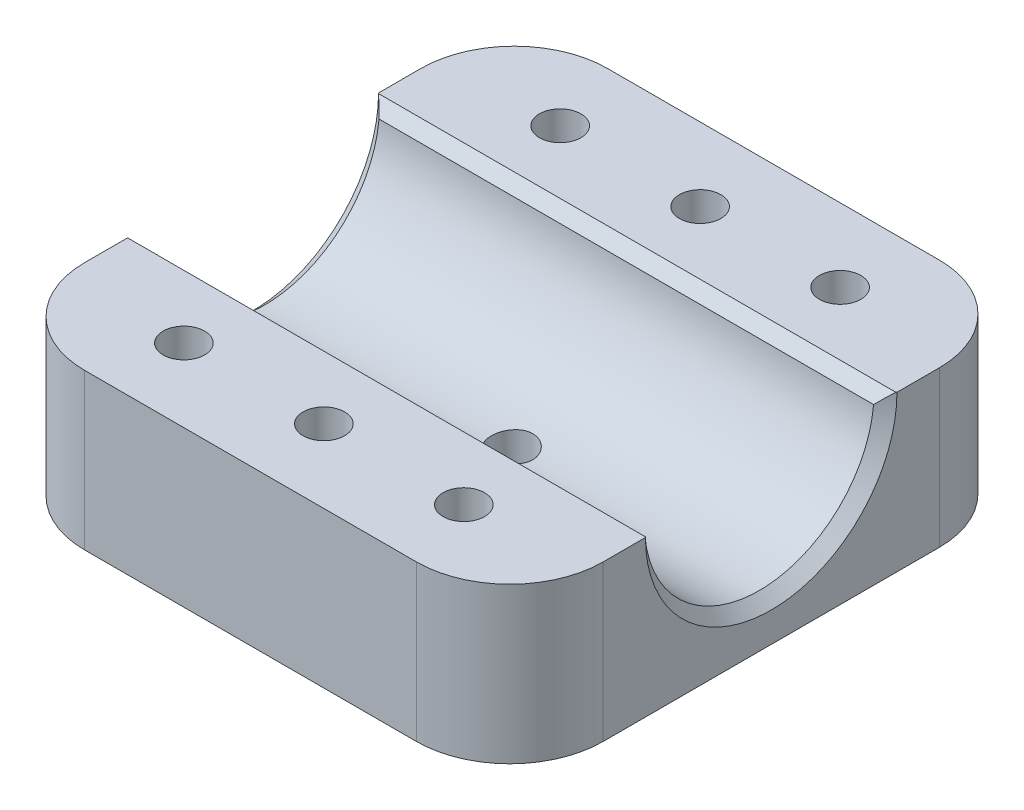
ISO-10303-21;
HEADER;
FILE_DESCRIPTION(('STEP AP214'),'2;1');
FILE_NAME('part.step','',(''),(''),'','','');
FILE_SCHEMA(('AUTOMOTIVE_DESIGN { 1 0 10303 214 1 1 1 1 }'));
ENDSEC;
DATA;
#1=APPLICATION_CONTEXT('core data for automotive mechanical design processes');
#2=APPLICATION_PROTOCOL_DEFINITION('international standard','automotive_design',2000,#1);
#3=PRODUCT_CONTEXT('',#1,'mechanical');
#4=PRODUCT('Part','Part','',(#3));
#5=PRODUCT_RELATED_PRODUCT_CATEGORY('part','',(#4));
#6=PRODUCT_DEFINITION_FORMATION('','',#4);
#7=PRODUCT_DEFINITION_CONTEXT('part definition',#1,'design');
#8=PRODUCT_DEFINITION('design','',#6,#7);
#9=PRODUCT_DEFINITION_SHAPE('','',#8);
#10=(LENGTH_UNIT() NAMED_UNIT(*) SI_UNIT(.MILLI.,.METRE.));
#11=(NAMED_UNIT(*) PLANE_ANGLE_UNIT() SI_UNIT($,.RADIAN.));
#12=(NAMED_UNIT(*) SI_UNIT($,.STERADIAN.) SOLID_ANGLE_UNIT());
#13=UNCERTAINTY_MEASURE_WITH_UNIT(LENGTH_MEASURE(1.E-05),#10,'distance_accuracy_value','');
#14=(GEOMETRIC_REPRESENTATION_CONTEXT(3) GLOBAL_UNCERTAINTY_ASSIGNED_CONTEXT((#13)) GLOBAL_UNIT_ASSIGNED_CONTEXT((#10,
#11,#12)) REPRESENTATION_CONTEXT('',''));
#15=CARTESIAN_POINT('',(0.,0.,0.));
#16=DIRECTION('',(0.,0.,1.));
#17=DIRECTION('',(1.,0.,0.));
#18=AXIS2_PLACEMENT_3D('',#15,#16,#17);
#19=CARTESIAN_POINT('',(50.,0.,-25.215));
#20=DIRECTION('',(-1.,0.,0.));
#21=DIRECTION('',(0.,0.,1.));
#22=AXIS2_PLACEMENT_3D('',#19,#20,#21);
#23=CYLINDRICAL_SURFACE('',#22,11.075);
#24=DIRECTION('',(-1.,0.,0.));
#25=VECTOR('',#24,1.);
#26=CARTESIAN_POINT('',(50.,-1.04987468829102,-14.189874688291));
#27=LINE('',#26,#25);
#28=CARTESIAN_POINT('',(1.14984968448844,-1.04987468829102,-14.189874688291));
#29=VERTEX_POINT('',#28);
#30=CARTESIAN_POINT('',(48.8501503155116,-1.04987468829102,-14.189874688291));
#31=VERTEX_POINT('',#30);
#32=EDGE_CURVE('E180',#29,#31,#27,.F.);
#33=ORIENTED_EDGE('',*,*,#32,.T.);
#34=CARTESIAN_POINT('',(48.8501503155116,0.,-25.215));
#35=DIRECTION('',(1.,0.,0.));
#36=DIRECTION('',(0.,0.,-1.));
#37=AXIS2_PLACEMENT_3D('',#34,#35,#36);
#38=CIRCLE('',#37,11.075);
#39=CARTESIAN_POINT('',(48.8501503155116,-1.04987468829102,-36.240125311709));
#40=VERTEX_POINT('',#39);
#41=EDGE_CURVE('E158',#31,#40,#38,.T.);
#42=ORIENTED_EDGE('',*,*,#41,.T.);
#43=DIRECTION('',(-1.,0.,0.));
#44=VECTOR('',#43,1.);
#45=CARTESIAN_POINT('',(50.,-1.04987468829102,-36.240125311709));
#46=LINE('',#45,#44);
#47=CARTESIAN_POINT('',(1.14984968448844,-1.04987468829102,-36.240125311709));
#48=VERTEX_POINT('',#47);
#49=EDGE_CURVE('E168',#40,#48,#46,.T.);
#50=ORIENTED_EDGE('',*,*,#49,.T.);
#51=CARTESIAN_POINT('',(1.14984968448844,0.,-25.215));
#52=DIRECTION('',(1.,0.,0.));
#53=DIRECTION('',(0.,0.,-1.));
#54=AXIS2_PLACEMENT_3D('',#51,#52,#53);
#55=CIRCLE('',#54,11.075);
#56=EDGE_CURVE('E175',#48,#29,#55,.F.);
#57=ORIENTED_EDGE('',*,*,#56,.T.);
#58=EDGE_LOOP('',(#33,#42,#50,#57));
#59=FACE_BOUND('',#58,.T.);
#60=CARTESIAN_POINT('',(25.,-10.8929162761861,-23.215));
#61=CARTESIAN_POINT('',(25.1113536940329,-10.892918389051,-23.2150043457988));
#62=CARTESIAN_POINT('',(25.2227646677859,-10.8946422884497,-23.2243312667743));
#63=CARTESIAN_POINT('',(25.4424504505853,-10.901343835157,-23.2613704590256));
#64=CARTESIAN_POINT('',(25.5507224331487,-10.9063243252863,-23.2890987940185));
#65=CARTESIAN_POINT('',(25.7609195576848,-10.9189569950914,-23.3620660279349));
#66=CARTESIAN_POINT('',(25.8628503067389,-10.9266067737828,-23.4072891944845));
#67=CARTESIAN_POINT('',(26.0576698569108,-10.9437132445331,-23.5139215128231));
#68=CARTESIAN_POINT('',(26.1505594693696,-10.9531697742301,-23.5753292103943));
#69=CARTESIAN_POINT('',(26.3257413903498,-10.972946272248,-23.713343784722));
#70=CARTESIAN_POINT('',(26.4079140871187,-10.9832741630362,-23.7901013715743));
#71=CARTESIAN_POINT('',(26.5582885540327,-11.0035595815764,-23.9563111244024));
#72=CARTESIAN_POINT('',(26.626489438445,-11.0135170858152,-24.0457640945847));
#73=CARTESIAN_POINT('',(26.7474394936063,-11.0320243248526,-24.2356074687583));
#74=CARTESIAN_POINT('',(26.8000763767631,-11.0405636434296,-24.3360705139597));
#75=CARTESIAN_POINT('',(26.8876814163901,-11.0551838557033,-24.544593350971));
#76=CARTESIAN_POINT('',(26.9226509203618,-11.0612649368842,-24.6526525627003));
#77=CARTESIAN_POINT('',(26.9735600302572,-11.070227552519,-24.8720619990178));
#78=CARTESIAN_POINT('',(26.9897010654613,-11.0731429302996,-24.9833640811887));
#79=CARTESIAN_POINT('',(27.0031222415719,-11.0755621777131,-25.2071321837155));
#80=CARTESIAN_POINT('',(27.0004038770695,-11.0750663176838,-25.3195981111324));
#81=CARTESIAN_POINT('',(26.9763387973658,-11.0707455248283,-25.5411214618447));
#82=CARTESIAN_POINT('',(26.9552089317007,-11.0669593465443,-25.6502033072089));
#83=CARTESIAN_POINT('',(26.8952630957274,-11.0565266996438,-25.863247275925));
#84=CARTESIAN_POINT('',(26.8564465160142,-11.0498801324715,-25.9672092227315));
#85=CARTESIAN_POINT('',(26.7620194492721,-11.0344083094483,-26.1676967596847));
#86=CARTESIAN_POINT('',(26.7063213612937,-11.0255717339673,-26.2641801817088));
#87=CARTESIAN_POINT('',(26.5797767574139,-11.0066987085288,-26.4465125101493));
#88=CARTESIAN_POINT('',(26.5089288086649,-10.9966621451182,-26.5323604094627));
#89=CARTESIAN_POINT('',(26.3528979171713,-10.9763338138186,-26.6922684115402));
#90=CARTESIAN_POINT('',(26.2675253145129,-10.9660404467502,-26.7661433682394));
#91=CARTESIAN_POINT('',(26.0855027975052,-10.946495721031,-26.8985527077549));
#92=CARTESIAN_POINT('',(25.9888527408879,-10.9372443755285,-26.9570868970133));
#93=CARTESIAN_POINT('',(25.7867840138122,-10.9208293251869,-27.0572002201364));
#94=CARTESIAN_POINT('',(25.6813525334477,-10.9136687413068,-27.0987540433314));
#95=CARTESIAN_POINT('',(25.464846632483,-10.9022949677093,-27.1635073612001));
#96=CARTESIAN_POINT('',(25.3537728029004,-10.8980814699744,-27.1867087740266));
#97=CARTESIAN_POINT('',(25.1308002567386,-10.8931394351379,-27.2138316718859));
#98=CARTESIAN_POINT('',(25.0189348404857,-10.8923629503183,-27.2180184405344));
#99=CARTESIAN_POINT('',(24.7961028347459,-10.8942547563627,-27.2077028884008));
#100=CARTESIAN_POINT('',(24.6851362044241,-10.896922889832,-27.1932014215388));
#101=CARTESIAN_POINT('',(24.4681136604313,-10.9053587631119,-27.1461482546176));
#102=CARTESIAN_POINT('',(24.3620268954011,-10.9111028508407,-27.1137342304303));
#103=CARTESIAN_POINT('',(24.1567904507839,-10.9250232265513,-27.0319215591093));
#104=CARTESIAN_POINT('',(24.0576412504744,-10.9331996823674,-26.9825217399137));
#105=CARTESIAN_POINT('',(23.8679215906163,-10.95117346907,-26.8675238569366));
#106=CARTESIAN_POINT('',(23.7774548066249,-10.9609872789544,-26.8017573762129));
#107=CARTESIAN_POINT('',(23.6087454058904,-10.9810830274729,-26.6561215300953));
#108=CARTESIAN_POINT('',(23.5305038063092,-10.9913650049678,-26.5762509923894));
#109=CARTESIAN_POINT('',(23.3874823911781,-11.0113918224963,-26.4034926740897));
#110=CARTESIAN_POINT('',(23.3228804792461,-11.0211284751913,-26.310456515694));
#111=CARTESIAN_POINT('',(23.2102245472426,-11.0388321041482,-26.1146974239208));
#112=CARTESIAN_POINT('',(23.162169923359,-11.0467991449795,-26.0119748441762));
#113=CARTESIAN_POINT('',(23.0842426256872,-11.0600305418415,-25.8002630426095));
#114=CARTESIAN_POINT('',(23.0542806216788,-11.065308156083,-25.6913075662955));
#115=CARTESIAN_POINT('',(23.0131030425445,-11.072622443831,-25.4698071689646));
#116=CARTESIAN_POINT('',(23.0018856438131,-11.074659432607,-25.3572625982056));
#117=CARTESIAN_POINT('',(22.9985754059351,-11.0752573113561,-25.1334885574448));
#118=CARTESIAN_POINT('',(23.0062131999577,-11.0738671620923,-25.0222631124987));
#119=CARTESIAN_POINT('',(23.039809105836,-11.067868081712,-24.8027076371961));
#120=CARTESIAN_POINT('',(23.0657670687041,-11.0632591767717,-24.6943775833006));
#121=CARTESIAN_POINT('',(23.1351563606031,-11.0513396837443,-24.4838168273849));
#122=CARTESIAN_POINT('',(23.1785609869827,-11.0440332257308,-24.3815770773001));
#123=CARTESIAN_POINT('',(23.2815800621458,-11.027511835667,-24.1857907506913));
#124=CARTESIAN_POINT('',(23.3411954902064,-11.0182967883289,-24.0922446998024));
#125=CARTESIAN_POINT('',(23.4758807363429,-10.9988216262283,-23.9151537180067));
#126=CARTESIAN_POINT('',(23.5511461068702,-10.988549210148,-23.8317588488928));
#127=CARTESIAN_POINT('',(23.7145871266544,-10.968197241856,-23.6786889165902));
#128=CARTESIAN_POINT('',(23.8027658012179,-10.9581177354663,-23.6090170774032));
#129=CARTESIAN_POINT('',(23.9904233185879,-10.9391997669254,-23.4848194546358));
#130=CARTESIAN_POINT('',(24.0899916689474,-10.9303725569761,-23.4304271581896));
#131=CARTESIAN_POINT('',(24.296977167732,-10.9150930928943,-23.3392271609959));
#132=CARTESIAN_POINT('',(24.404386641961,-10.9086385529839,-23.3024025257101));
#133=CARTESIAN_POINT('',(24.5934579436549,-10.90021082846,-23.2550454155816));
#134=CARTESIAN_POINT('',(24.6739990415081,-10.8974912539126,-23.2400535454527));
#135=CARTESIAN_POINT('',(24.8363497995602,-10.8938432226872,-23.2200293593708));
#136=CARTESIAN_POINT('',(24.9181594294732,-10.8929147233138,-23.2149968060094));
#137=CARTESIAN_POINT('',(25.,-10.8929162761861,-23.215));
#138=B_SPLINE_CURVE_WITH_KNOTS('',3,(#60,#61,#62,#63,#64,#65,#66,#67,#68,#69,#70,#71,#72,#73,
#74,#75,#76,#77,#78,#79,#80,#81,#82,#83,#84,#85,#86,#87,#88,#89,#90,#91,#92,#93,#94,#95,#96,#97,
#98,#99,#100,#101,#102,#103,#104,#105,#106,#107,#108,#109,#110,#111,#112,#113,#114,#115,#116,
#117,#118,#119,#120,#121,#122,#123,#124,#125,#126,#127,#128,#129,#130,#131,#132,#133,#134,#135,
#136,#137),.UNSPECIFIED.,.T.,.F.,(4,2,2,2,2,2,2,2,2,2,2,2,2,2,2,2,2,2,2,2,2,2,2,2,2,2,2,2,2,2,2,
2,2,2,2,2,2,2,4),(0.,0.333761663850657,0.667815072563988,1.00156877663258,1.33529250237122,
1.67246971129049,2.00966828870264,2.34924336121043,2.68879253021281,3.02467484272518,
3.36053053715841,3.69248321009001,4.0244473214876,4.35816443159666,4.69191311806564,
5.03041156733624,5.36891428731549,5.70791974967007,6.04688977524767,6.38111581969542,
6.7153265929222,7.04700364783416,7.3787035938776,7.71396919555588,8.0492626772261,
8.38869086857851,8.72810667284707,9.06583264879393,9.40352576649545,9.73642256522186,
10.0693166567166,10.401703171971,10.7341097707942,11.070950668557,11.4078706074446,
11.7476484208781,12.0870980366405,12.3324055352903,12.577707186275),.UNSPECIFIED.);
#139=CARTESIAN_POINT('',(25.,-10.8929162761861,-23.215));
#140=VERTEX_POINT('',#139);
#141=EDGE_CURVE('E401',#140,#140,#138,.T.);
#142=ORIENTED_EDGE('',*,*,#141,.F.);
#143=EDGE_LOOP('',(#142));
#144=FACE_BOUND('',#143,.T.);
#145=ADVANCED_FACE('F49',(#59,#144),#23,.F.);
#146=CARTESIAN_POINT('',(50.,0.,0.));
#147=DIRECTION('',(0.,1.,0.));
#148=DIRECTION('',(0.,0.,1.));
#149=AXIS2_PLACEMENT_3D('',#146,#147,#148);
#150=PLANE('',#149);
#151=CARTESIAN_POINT('',(38.5,0.,-7.07));
#152=DIRECTION('',(0.,1.,0.));
#153=DIRECTION('',(0.,0.,1.));
#154=AXIS2_PLACEMENT_3D('',#151,#152,#153);
#155=CIRCLE('',#154,2.);
#156=CARTESIAN_POINT('',(38.5,0.,-5.07));
#157=VERTEX_POINT('',#156);
#158=EDGE_CURVE('E381',#157,#157,#155,.T.);
#159=ORIENTED_EDGE('',*,*,#158,.F.);
#160=EDGE_LOOP('',(#159));
#161=FACE_BOUND('',#160,.T.);
#162=CARTESIAN_POINT('',(11.5,0.,-7.07));
#163=DIRECTION('',(0.,1.,0.));
#164=DIRECTION('',(0.,0.,-1.));
#165=AXIS2_PLACEMENT_3D('',#162,#163,#164);
#166=CIRCLE('',#165,2.);
#167=CARTESIAN_POINT('',(11.5,0.,-9.07));
#168=VERTEX_POINT('',#167);
#169=EDGE_CURVE('E373',#168,#168,#166,.T.);
#170=ORIENTED_EDGE('',*,*,#169,.F.);
#171=EDGE_LOOP('',(#170));
#172=FACE_BOUND('',#171,.T.);
#173=CARTESIAN_POINT('',(25.,0.,-7.07));
#174=DIRECTION('',(0.,1.,0.));
#175=DIRECTION('',(0.,0.,1.));
#176=AXIS2_PLACEMENT_3D('',#173,#174,#175);
#177=CIRCLE('',#176,2.);
#178=CARTESIAN_POINT('',(25.,0.,-5.07));
#179=VERTEX_POINT('',#178);
#180=EDGE_CURVE('E353',#179,#179,#177,.T.);
#181=ORIENTED_EDGE('',*,*,#180,.F.);
#182=EDGE_LOOP('',(#181));
#183=FACE_BOUND('',#182,.T.);
#184=DIRECTION('',(0.,0.,-1.));
#185=VECTOR('',#184,1.);
#186=CARTESIAN_POINT('',(0.,0.,0.));
#187=LINE('',#186,#185);
#188=CARTESIAN_POINT('',(0.,0.,-9.));
#189=VERTEX_POINT('',#188);
#190=CARTESIAN_POINT('',(0.,0.,-13.0853759622601));
#191=VERTEX_POINT('',#190);
#192=EDGE_CURVE('E405',#189,#191,#187,.T.);
#193=ORIENTED_EDGE('',*,*,#192,.F.);
#194=CARTESIAN_POINT('',(9.,0.,-9.));
#195=DIRECTION('',(0.,1.,0.));
#196=DIRECTION('',(0.,0.,1.));
#197=AXIS2_PLACEMENT_3D('',#194,#195,#196);
#198=CIRCLE('',#197,9.);
#199=CARTESIAN_POINT('',(9.,0.,0.));
#200=VERTEX_POINT('',#199);
#201=EDGE_CURVE('E292',#189,#200,#198,.T.);
#202=ORIENTED_EDGE('',*,*,#201,.T.);
#203=DIRECTION('',(-1.,0.,0.));
#204=VECTOR('',#203,1.);
#205=CARTESIAN_POINT('',(50.,0.,0.));
#206=LINE('',#205,#204);
#207=CARTESIAN_POINT('',(41.,0.,0.));
#208=VERTEX_POINT('',#207);
#209=EDGE_CURVE('E176',#208,#200,#206,.T.);
#210=ORIENTED_EDGE('',*,*,#209,.F.);
#211=CARTESIAN_POINT('',(41.,0.,-9.));
#212=DIRECTION('',(0.,1.,0.));
#213=DIRECTION('',(0.,0.,1.));
#214=AXIS2_PLACEMENT_3D('',#211,#212,#213);
#215=CIRCLE('',#214,9.);
#216=CARTESIAN_POINT('',(50.,0.,-9.));
#217=VERTEX_POINT('',#216);
#218=EDGE_CURVE('E289',#208,#217,#215,.T.);
#219=ORIENTED_EDGE('',*,*,#218,.T.);
#220=DIRECTION('',(0.,0.,-1.));
#221=VECTOR('',#220,1.);
#222=CARTESIAN_POINT('',(50.,0.,0.));
#223=LINE('',#222,#221);
#224=CARTESIAN_POINT('',(50.,0.,-13.0853759622601));
#225=VERTEX_POINT('',#224);
#226=EDGE_CURVE('E322',#217,#225,#223,.T.);
#227=ORIENTED_EDGE('',*,*,#226,.T.);
#228=DIRECTION('',(0.73696410507802,0.,0.675931881055001));
#229=VECTOR('',#228,1.);
#230=CARTESIAN_POINT('',(36.7751503155117,0.,-25.215));
#231=LINE('',#230,#229);
#232=CARTESIAN_POINT('',(49.9404437692362,0.,-13.14));
#233=VERTEX_POINT('',#232);
#234=EDGE_CURVE('E207',#225,#233,#231,.F.);
#235=ORIENTED_EDGE('',*,*,#234,.T.);
#236=DIRECTION('',(-1.,0.,0.));
#237=VECTOR('',#236,1.);
#238=CARTESIAN_POINT('',(50.,0.,-13.14));
#239=LINE('',#238,#237);
#240=CARTESIAN_POINT('',(0.0595562307638409,0.,-13.14));
#241=VERTEX_POINT('',#240);
#242=EDGE_CURVE('E204',#233,#241,#239,.T.);
#243=ORIENTED_EDGE('',*,*,#242,.T.);
#244=DIRECTION('',(0.73696410507802,0.,-0.675931881055001));
#245=VECTOR('',#244,1.);
#246=CARTESIAN_POINT('',(13.2248496844883,0.,-25.215));
#247=LINE('',#246,#245);
#248=EDGE_CURVE('E200',#241,#191,#247,.F.);
#249=ORIENTED_EDGE('',*,*,#248,.T.);
#250=EDGE_LOOP('',(#193,#202,#210,#219,#227,#235,#243,#249));
#251=FACE_BOUND('',#250,.T.);
#252=ADVANCED_FACE('F454',(#161,#172,#183,#251),#150,.T.);
#253=CARTESIAN_POINT('',(50.,0.,0.));
#254=DIRECTION('',(0.,0.,-1.));
#255=DIRECTION('',(0.,1.,0.));
#256=AXIS2_PLACEMENT_3D('',#253,#254,#255);
#257=PLANE('',#256);
#258=ORIENTED_EDGE('',*,*,#209,.T.);
#259=DIRECTION('',(0.,-1.,0.));
#260=VECTOR('',#259,1.);
#261=CARTESIAN_POINT('',(9.,0.,0.));
#262=LINE('',#261,#260);
#263=CARTESIAN_POINT('',(9.,-15.,0.));
#264=VERTEX_POINT('',#263);
#265=EDGE_CURVE('E266',#200,#264,#262,.T.);
#266=ORIENTED_EDGE('',*,*,#265,.T.);
#267=DIRECTION('',(-1.,0.,0.));
#268=VECTOR('',#267,1.);
#269=CARTESIAN_POINT('',(50.,-15.,0.));
#270=LINE('',#269,#268);
#271=CARTESIAN_POINT('',(41.,-15.,0.));
#272=VERTEX_POINT('',#271);
#273=EDGE_CURVE('E333',#272,#264,#270,.T.);
#274=ORIENTED_EDGE('',*,*,#273,.F.);
#275=DIRECTION('',(0.,-1.,0.));
#276=VECTOR('',#275,1.);
#277=CARTESIAN_POINT('',(41.,0.,0.));
#278=LINE('',#277,#276);
#279=EDGE_CURVE('E213',#272,#208,#278,.F.);
#280=ORIENTED_EDGE('',*,*,#279,.T.);
#281=EDGE_LOOP('',(#258,#266,#274,#280));
#282=FACE_BOUND('',#281,.T.);
#283=ADVANCED_FACE('F451',(#282),#257,.F.);
#284=CARTESIAN_POINT('',(50.,-15.,0.));
#285=DIRECTION('',(0.,-1.,0.));
#286=DIRECTION('',(0.,0.,-1.));
#287=AXIS2_PLACEMENT_3D('',#284,#285,#286);
#288=PLANE('',#287);
#289=CARTESIAN_POINT('',(38.5,-15.,-43.36));
#290=DIRECTION('',(0.,1.,0.));
#291=DIRECTION('',(0.,0.,-1.));
#292=AXIS2_PLACEMENT_3D('',#289,#290,#291);
#293=CIRCLE('',#292,2.);
#294=CARTESIAN_POINT('',(38.5,-15.,-45.36));
#295=VERTEX_POINT('',#294);
#296=EDGE_CURVE('E385',#295,#295,#293,.T.);
#297=ORIENTED_EDGE('',*,*,#296,.T.);
#298=EDGE_LOOP('',(#297));
#299=FACE_BOUND('',#298,.T.);
#300=CARTESIAN_POINT('',(38.5,-15.,-7.06999999999999));
#301=DIRECTION('',(0.,1.,0.));
#302=DIRECTION('',(0.,0.,1.));
#303=AXIS2_PLACEMENT_3D('',#300,#301,#302);
#304=CIRCLE('',#303,2.);
#305=CARTESIAN_POINT('',(38.5,-15.,-5.07));
#306=VERTEX_POINT('',#305);
#307=EDGE_CURVE('E377',#306,#306,#304,.T.);
#308=ORIENTED_EDGE('',*,*,#307,.T.);
#309=EDGE_LOOP('',(#308));
#310=FACE_BOUND('',#309,.T.);
#311=CARTESIAN_POINT('',(11.5,-15.,-7.06999999999999));
#312=DIRECTION('',(0.,1.,0.));
#313=DIRECTION('',(0.,0.,-1.));
#314=AXIS2_PLACEMENT_3D('',#311,#312,#313);
#315=CIRCLE('',#314,2.);
#316=CARTESIAN_POINT('',(11.5,-15.,-9.06999999999999));
#317=VERTEX_POINT('',#316);
#318=EDGE_CURVE('E369',#317,#317,#315,.T.);
#319=ORIENTED_EDGE('',*,*,#318,.T.);
#320=EDGE_LOOP('',(#319));
#321=FACE_BOUND('',#320,.T.);
#322=CARTESIAN_POINT('',(25.,-15.,-25.215));
#323=DIRECTION('',(0.,1.,0.));
#324=DIRECTION('',(0.,0.,1.));
#325=AXIS2_PLACEMENT_3D('',#322,#323,#324);
#326=CIRCLE('',#325,2.00000000000001);
#327=CARTESIAN_POINT('',(25.,-15.,-23.215));
#328=VERTEX_POINT('',#327);
#329=EDGE_CURVE('E365',#328,#328,#326,.T.);
#330=ORIENTED_EDGE('',*,*,#329,.T.);
#331=EDGE_LOOP('',(#330));
#332=FACE_BOUND('',#331,.T.);
#333=CARTESIAN_POINT('',(25.,-15.,-43.36));
#334=DIRECTION('',(0.,1.,0.));
#335=DIRECTION('',(0.,0.,1.));
#336=AXIS2_PLACEMENT_3D('',#333,#334,#335);
#337=CIRCLE('',#336,2.);
#338=CARTESIAN_POINT('',(25.,-15.,-41.36));
#339=VERTEX_POINT('',#338);
#340=EDGE_CURVE('E357',#339,#339,#337,.T.);
#341=ORIENTED_EDGE('',*,*,#340,.T.);
#342=EDGE_LOOP('',(#341));
#343=FACE_BOUND('',#342,.T.);
#344=CARTESIAN_POINT('',(25.,-15.,-7.06999999999999));
#345=DIRECTION('',(0.,1.,0.));
#346=DIRECTION('',(0.,0.,1.));
#347=AXIS2_PLACEMENT_3D('',#344,#345,#346);
#348=CIRCLE('',#347,2.);
#349=CARTESIAN_POINT('',(25.,-15.,-5.06999999999999));
#350=VERTEX_POINT('',#349);
#351=EDGE_CURVE('E259',#350,#350,#348,.T.);
#352=ORIENTED_EDGE('',*,*,#351,.T.);
#353=EDGE_LOOP('',(#352));
#354=FACE_BOUND('',#353,.T.);
#355=CARTESIAN_POINT('',(11.5,-15.,-43.36));
#356=DIRECTION('',(0.,1.,0.));
#357=DIRECTION('',(0.,0.,1.));
#358=AXIS2_PLACEMENT_3D('',#355,#356,#357);
#359=CIRCLE('',#358,2.);
#360=CARTESIAN_POINT('',(11.5,-15.,-41.36));
#361=VERTEX_POINT('',#360);
#362=EDGE_CURVE('E397',#361,#361,#359,.T.);
#363=ORIENTED_EDGE('',*,*,#362,.T.);
#364=EDGE_LOOP('',(#363));
#365=FACE_BOUND('',#364,.T.);
#366=ORIENTED_EDGE('',*,*,#273,.T.);
#367=CARTESIAN_POINT('',(9.,-15.,-9.));
#368=DIRECTION('',(0.,-1.,0.));
#369=DIRECTION('',(0.,0.,-1.));
#370=AXIS2_PLACEMENT_3D('',#367,#368,#369);
#371=CIRCLE('',#370,9.);
#372=CARTESIAN_POINT('',(0.,-15.,-9.));
#373=VERTEX_POINT('',#372);
#374=EDGE_CURVE('E279',#264,#373,#371,.T.);
#375=ORIENTED_EDGE('',*,*,#374,.T.);
#376=DIRECTION('',(0.,0.,1.));
#377=VECTOR('',#376,1.);
#378=CARTESIAN_POINT('',(0.,-15.,0.));
#379=LINE('',#378,#377);
#380=CARTESIAN_POINT('',(0.,-15.,-41.43));
#381=VERTEX_POINT('',#380);
#382=EDGE_CURVE('E323',#381,#373,#379,.T.);
#383=ORIENTED_EDGE('',*,*,#382,.F.);
#384=CARTESIAN_POINT('',(9.,-15.,-41.43));
#385=DIRECTION('',(0.,-1.,0.));
#386=DIRECTION('',(0.,0.,-1.));
#387=AXIS2_PLACEMENT_3D('',#384,#385,#386);
#388=CIRCLE('',#387,9.);
#389=CARTESIAN_POINT('',(9.,-15.,-50.43));
#390=VERTEX_POINT('',#389);
#391=EDGE_CURVE('E270',#381,#390,#388,.T.);
#392=ORIENTED_EDGE('',*,*,#391,.T.);
#393=DIRECTION('',(-1.,0.,0.));
#394=VECTOR('',#393,1.);
#395=CARTESIAN_POINT('',(50.,-15.,-50.43));
#396=LINE('',#395,#394);
#397=CARTESIAN_POINT('',(41.,-15.,-50.43));
#398=VERTEX_POINT('',#397);
#399=EDGE_CURVE('E329',#398,#390,#396,.T.);
#400=ORIENTED_EDGE('',*,*,#399,.F.);
#401=CARTESIAN_POINT('',(41.,-15.,-41.43));
#402=DIRECTION('',(0.,-1.,0.));
#403=DIRECTION('',(0.,0.,-1.));
#404=AXIS2_PLACEMENT_3D('',#401,#402,#403);
#405=CIRCLE('',#404,9.);
#406=CARTESIAN_POINT('',(50.,-15.,-41.43));
#407=VERTEX_POINT('',#406);
#408=EDGE_CURVE('E273',#398,#407,#405,.T.);
#409=ORIENTED_EDGE('',*,*,#408,.T.);
#410=DIRECTION('',(0.,0.,1.));
#411=VECTOR('',#410,1.);
#412=CARTESIAN_POINT('',(50.,-15.,0.));
#413=LINE('',#412,#411);
#414=CARTESIAN_POINT('',(50.,-15.,-9.));
#415=VERTEX_POINT('',#414);
#416=EDGE_CURVE('E412',#407,#415,#413,.T.);
#417=ORIENTED_EDGE('',*,*,#416,.T.);
#418=CARTESIAN_POINT('',(41.,-15.,-9.));
#419=DIRECTION('',(0.,-1.,0.));
#420=DIRECTION('',(0.,0.,-1.));
#421=AXIS2_PLACEMENT_3D('',#418,#419,#420);
#422=CIRCLE('',#421,9.);
#423=EDGE_CURVE('E276',#415,#272,#422,.T.);
#424=ORIENTED_EDGE('',*,*,#423,.T.);
#425=EDGE_LOOP('',(#366,#375,#383,#392,#400,#409,#417,#424));
#426=FACE_BOUND('',#425,.T.);
#427=ADVANCED_FACE('F328',(#299,#310,#321,#332,#343,#354,#365,#426),#288,.T.);
#428=CARTESIAN_POINT('',(50.,0.,-50.43));
#429=DIRECTION('',(0.,0.,-1.));
#430=DIRECTION('',(-1.,0.,0.));
#431=AXIS2_PLACEMENT_3D('',#428,#429,#430);
#432=PLANE('',#431);
#433=DIRECTION('',(-1.,0.,0.));
#434=VECTOR('',#433,1.);
#435=CARTESIAN_POINT('',(50.,0.,-50.43));
#436=LINE('',#435,#434);
#437=CARTESIAN_POINT('',(41.,0.,-50.43));
#438=VERTEX_POINT('',#437);
#439=CARTESIAN_POINT('',(9.,0.,-50.43));
#440=VERTEX_POINT('',#439);
#441=EDGE_CURVE('E312',#438,#440,#436,.T.);
#442=ORIENTED_EDGE('',*,*,#441,.F.);
#443=DIRECTION('',(0.,-1.,0.));
#444=VECTOR('',#443,1.);
#445=CARTESIAN_POINT('',(41.,0.,-50.43));
#446=LINE('',#445,#444);
#447=EDGE_CURVE('E304',#438,#398,#446,.T.);
#448=ORIENTED_EDGE('',*,*,#447,.T.);
#449=ORIENTED_EDGE('',*,*,#399,.T.);
#450=DIRECTION('',(0.,-1.,0.));
#451=VECTOR('',#450,1.);
#452=CARTESIAN_POINT('',(9.,0.,-50.43));
#453=LINE('',#452,#451);
#454=EDGE_CURVE('E65',#390,#440,#453,.F.);
#455=ORIENTED_EDGE('',*,*,#454,.T.);
#456=EDGE_LOOP('',(#442,#448,#449,#455));
#457=FACE_BOUND('',#456,.T.);
#458=ADVANCED_FACE('F330',(#457),#432,.T.);
#459=CARTESIAN_POINT('',(50.,0.,0.));
#460=DIRECTION('',(0.,-1.,0.));
#461=DIRECTION('',(0.,0.,-1.));
#462=AXIS2_PLACEMENT_3D('',#459,#460,#461);
#463=PLANE('',#462);
#464=CARTESIAN_POINT('',(38.5,0.,-43.36));
#465=DIRECTION('',(0.,1.,0.));
#466=DIRECTION('',(0.,0.,-1.));
#467=AXIS2_PLACEMENT_3D('',#464,#465,#466);
#468=CIRCLE('',#467,2.);
#469=CARTESIAN_POINT('',(38.5,0.,-45.36));
#470=VERTEX_POINT('',#469);
#471=EDGE_CURVE('E389',#470,#470,#468,.T.);
#472=ORIENTED_EDGE('',*,*,#471,.F.);
#473=EDGE_LOOP('',(#472));
#474=FACE_BOUND('',#473,.T.);
#475=CARTESIAN_POINT('',(25.,0.,-43.36));
#476=DIRECTION('',(0.,1.,0.));
#477=DIRECTION('',(0.,0.,1.));
#478=AXIS2_PLACEMENT_3D('',#475,#476,#477);
#479=CIRCLE('',#478,2.);
#480=CARTESIAN_POINT('',(25.,0.,-41.36));
#481=VERTEX_POINT('',#480);
#482=EDGE_CURVE('E361',#481,#481,#479,.T.);
#483=ORIENTED_EDGE('',*,*,#482,.F.);
#484=EDGE_LOOP('',(#483));
#485=FACE_BOUND('',#484,.T.);
#486=CARTESIAN_POINT('',(11.5,0.,-43.36));
#487=DIRECTION('',(0.,1.,0.));
#488=DIRECTION('',(0.,0.,1.));
#489=AXIS2_PLACEMENT_3D('',#486,#487,#488);
#490=CIRCLE('',#489,2.);
#491=CARTESIAN_POINT('',(11.5,0.,-41.36));
#492=VERTEX_POINT('',#491);
#493=EDGE_CURVE('E393',#492,#492,#490,.T.);
#494=ORIENTED_EDGE('',*,*,#493,.F.);
#495=EDGE_LOOP('',(#494));
#496=FACE_BOUND('',#495,.T.);
#497=DIRECTION('',(0.,0.,1.));
#498=VECTOR('',#497,1.);
#499=CARTESIAN_POINT('',(50.,0.,0.));
#500=LINE('',#499,#498);
#501=CARTESIAN_POINT('',(50.,0.,-41.43));
#502=VERTEX_POINT('',#501);
#503=CARTESIAN_POINT('',(50.,0.,-37.3446240377399));
#504=VERTEX_POINT('',#503);
#505=EDGE_CURVE('E338',#502,#504,#500,.T.);
#506=ORIENTED_EDGE('',*,*,#505,.F.);
#507=CARTESIAN_POINT('',(41.,0.,-41.43));
#508=DIRECTION('',(0.,-1.,0.));
#509=DIRECTION('',(0.,0.,-1.));
#510=AXIS2_PLACEMENT_3D('',#507,#508,#509);
#511=CIRCLE('',#510,9.);
#512=EDGE_CURVE('E11',#502,#438,#511,.F.);
#513=ORIENTED_EDGE('',*,*,#512,.T.);
#514=ORIENTED_EDGE('',*,*,#441,.T.);
#515=CARTESIAN_POINT('',(9.,0.,-41.43));
#516=DIRECTION('',(0.,-1.,0.));
#517=DIRECTION('',(0.,0.,-1.));
#518=AXIS2_PLACEMENT_3D('',#515,#516,#517);
#519=CIRCLE('',#518,9.);
#520=CARTESIAN_POINT('',(0.,0.,-41.43));
#521=VERTEX_POINT('',#520);
#522=EDGE_CURVE('E58',#440,#521,#519,.F.);
#523=ORIENTED_EDGE('',*,*,#522,.T.);
#524=DIRECTION('',(0.,0.,1.));
#525=VECTOR('',#524,1.);
#526=CARTESIAN_POINT('',(0.,0.,0.));
#527=LINE('',#526,#525);
#528=CARTESIAN_POINT('',(0.,0.,-37.3446240377399));
#529=VERTEX_POINT('',#528);
#530=EDGE_CURVE('E311',#521,#529,#527,.T.);
#531=ORIENTED_EDGE('',*,*,#530,.T.);
#532=DIRECTION('',(0.73696410507802,0.,0.675931881055001));
#533=VECTOR('',#532,1.);
#534=CARTESIAN_POINT('',(13.2248496844883,0.,-25.215));
#535=LINE('',#534,#533);
#536=CARTESIAN_POINT('',(0.0595562307638409,0.,-37.29));
#537=VERTEX_POINT('',#536);
#538=EDGE_CURVE('E187',#529,#537,#535,.T.);
#539=ORIENTED_EDGE('',*,*,#538,.T.);
#540=DIRECTION('',(1.,0.,0.));
#541=VECTOR('',#540,1.);
#542=CARTESIAN_POINT('',(50.,0.,-37.29));
#543=LINE('',#542,#541);
#544=CARTESIAN_POINT('',(49.9404437692362,0.,-37.29));
#545=VERTEX_POINT('',#544);
#546=EDGE_CURVE('E183',#537,#545,#543,.T.);
#547=ORIENTED_EDGE('',*,*,#546,.T.);
#548=DIRECTION('',(0.73696410507802,0.,-0.675931881055001));
#549=VECTOR('',#548,1.);
#550=CARTESIAN_POINT('',(36.7751503155117,0.,-25.215));
#551=LINE('',#550,#549);
#552=EDGE_CURVE('E161',#545,#504,#551,.T.);
#553=ORIENTED_EDGE('',*,*,#552,.T.);
#554=EDGE_LOOP('',(#506,#513,#514,#523,#531,#539,#547,#553));
#555=FACE_BOUND('',#554,.T.);
#556=ADVANCED_FACE('F310',(#474,#485,#496,#555),#463,.F.);
#557=CARTESIAN_POINT('',(50.,0.,0.));
#558=DIRECTION('',(1.,0.,0.));
#559=DIRECTION('',(0.,0.,-1.));
#560=AXIS2_PLACEMENT_3D('',#557,#558,#559);
#561=PLANE('',#560);
#562=ORIENTED_EDGE('',*,*,#226,.F.);
#563=DIRECTION('',(0.,-1.,0.));
#564=VECTOR('',#563,1.);
#565=CARTESIAN_POINT('',(50.,-15.,-9.));
#566=LINE('',#565,#564);
#567=EDGE_CURVE('E298',#217,#415,#566,.T.);
#568=ORIENTED_EDGE('',*,*,#567,.T.);
#569=ORIENTED_EDGE('',*,*,#416,.F.);
#570=DIRECTION('',(0.,-1.,0.));
#571=VECTOR('',#570,1.);
#572=CARTESIAN_POINT('',(50.,0.,-41.43));
#573=LINE('',#572,#571);
#574=EDGE_CURVE('E295',#407,#502,#573,.F.);
#575=ORIENTED_EDGE('',*,*,#574,.T.);
#576=ORIENTED_EDGE('',*,*,#505,.T.);
#577=CARTESIAN_POINT('',(50.,0.,-25.215));
#578=DIRECTION('',(1.,0.,0.));
#579=DIRECTION('',(0.,0.,-1.));
#580=AXIS2_PLACEMENT_3D('',#577,#578,#579);
#581=CIRCLE('',#580,12.1296240377399);
#582=EDGE_CURVE('E196',#504,#225,#581,.F.);
#583=ORIENTED_EDGE('',*,*,#582,.T.);
#584=EDGE_LOOP('',(#562,#568,#569,#575,#576,#583));
#585=FACE_BOUND('',#584,.T.);
#586=ADVANCED_FACE('F439',(#585),#561,.T.);
#587=CARTESIAN_POINT('',(0.,0.,0.));
#588=DIRECTION('',(1.,0.,0.));
#589=DIRECTION('',(0.,0.,-1.));
#590=AXIS2_PLACEMENT_3D('',#587,#588,#589);
#591=PLANE('',#590);
#592=ORIENTED_EDGE('',*,*,#382,.T.);
#593=DIRECTION('',(0.,-1.,0.));
#594=VECTOR('',#593,1.);
#595=CARTESIAN_POINT('',(0.,0.,-9.));
#596=LINE('',#595,#594);
#597=EDGE_CURVE('E286',#373,#189,#596,.F.);
#598=ORIENTED_EDGE('',*,*,#597,.T.);
#599=ORIENTED_EDGE('',*,*,#192,.T.);
#600=CARTESIAN_POINT('',(0.,0.,-25.215));
#601=DIRECTION('',(1.,0.,0.));
#602=DIRECTION('',(0.,0.,-1.));
#603=AXIS2_PLACEMENT_3D('',#600,#601,#602);
#604=CIRCLE('',#603,12.1296240377399);
#605=EDGE_CURVE('E210',#191,#529,#604,.T.);
#606=ORIENTED_EDGE('',*,*,#605,.T.);
#607=ORIENTED_EDGE('',*,*,#530,.F.);
#608=DIRECTION('',(0.,-1.,0.));
#609=VECTOR('',#608,1.);
#610=CARTESIAN_POINT('',(0.,-15.,-41.43));
#611=LINE('',#610,#609);
#612=EDGE_CURVE('E282',#521,#381,#611,.T.);
#613=ORIENTED_EDGE('',*,*,#612,.T.);
#614=EDGE_LOOP('',(#592,#598,#599,#606,#607,#613));
#615=FACE_BOUND('',#614,.T.);
#616=ADVANCED_FACE('F317',(#615),#591,.F.);
#617=CARTESIAN_POINT('',(11.5,-15.,-43.36));
#618=DIRECTION('',(0.,1.,0.));
#619=DIRECTION('',(0.,0.,1.));
#620=AXIS2_PLACEMENT_3D('',#617,#618,#619);
#621=CYLINDRICAL_SURFACE('',#620,2.);
#622=ORIENTED_EDGE('',*,*,#362,.F.);
#623=EDGE_LOOP('',(#622));
#624=FACE_BOUND('',#623,.T.);
#625=ORIENTED_EDGE('',*,*,#493,.T.);
#626=EDGE_LOOP('',(#625));
#627=FACE_BOUND('',#626,.T.);
#628=ADVANCED_FACE('F434',(#624,#627),#621,.F.);
#629=CARTESIAN_POINT('',(25.,-15.,-43.36));
#630=DIRECTION('',(0.,1.,0.));
#631=DIRECTION('',(0.,0.,1.));
#632=AXIS2_PLACEMENT_3D('',#629,#630,#631);
#633=CYLINDRICAL_SURFACE('',#632,2.);
#634=ORIENTED_EDGE('',*,*,#340,.F.);
#635=EDGE_LOOP('',(#634));
#636=FACE_BOUND('',#635,.T.);
#637=ORIENTED_EDGE('',*,*,#482,.T.);
#638=EDGE_LOOP('',(#637));
#639=FACE_BOUND('',#638,.T.);
#640=ADVANCED_FACE('F437',(#636,#639),#633,.F.);
#641=CARTESIAN_POINT('',(38.5,-15.,-43.36));
#642=DIRECTION('',(0.,1.,0.));
#643=DIRECTION('',(0.,0.,1.));
#644=AXIS2_PLACEMENT_3D('',#641,#642,#643);
#645=CYLINDRICAL_SURFACE('',#644,2.);
#646=ORIENTED_EDGE('',*,*,#296,.F.);
#647=EDGE_LOOP('',(#646));
#648=FACE_BOUND('',#647,.T.);
#649=ORIENTED_EDGE('',*,*,#471,.T.);
#650=EDGE_LOOP('',(#649));
#651=FACE_BOUND('',#650,.T.);
#652=ADVANCED_FACE('F562',(#648,#651),#645,.F.);
#653=CARTESIAN_POINT('',(25.,-15.,-7.06999999999999));
#654=DIRECTION('',(0.,1.,0.));
#655=DIRECTION('',(0.,0.,1.));
#656=AXIS2_PLACEMENT_3D('',#653,#654,#655);
#657=CYLINDRICAL_SURFACE('',#656,2.);
#658=ORIENTED_EDGE('',*,*,#351,.F.);
#659=EDGE_LOOP('',(#658));
#660=FACE_BOUND('',#659,.T.);
#661=ORIENTED_EDGE('',*,*,#180,.T.);
#662=EDGE_LOOP('',(#661));
#663=FACE_BOUND('',#662,.T.);
#664=ADVANCED_FACE('F431',(#660,#663),#657,.F.);
#665=CARTESIAN_POINT('',(25.,-15.,-25.215));
#666=DIRECTION('',(0.,1.,0.));
#667=DIRECTION('',(0.,0.,1.));
#668=AXIS2_PLACEMENT_3D('',#665,#666,#667);
#669=CYLINDRICAL_SURFACE('',#668,2.00000000000001);
#670=ORIENTED_EDGE('',*,*,#141,.T.);
#671=EDGE_LOOP('',(#670));
#672=FACE_BOUND('',#671,.T.);
#673=ORIENTED_EDGE('',*,*,#329,.F.);
#674=EDGE_LOOP('',(#673));
#675=FACE_BOUND('',#674,.T.);
#676=ADVANCED_FACE('F425',(#672,#675),#669,.F.);
#677=CARTESIAN_POINT('',(11.5,-15.,-7.06999999999999));
#678=DIRECTION('',(0.,1.,0.));
#679=DIRECTION('',(0.,0.,1.));
#680=AXIS2_PLACEMENT_3D('',#677,#678,#679);
#681=CYLINDRICAL_SURFACE('',#680,2.);
#682=ORIENTED_EDGE('',*,*,#318,.F.);
#683=EDGE_LOOP('',(#682));
#684=FACE_BOUND('',#683,.T.);
#685=ORIENTED_EDGE('',*,*,#169,.T.);
#686=EDGE_LOOP('',(#685));
#687=FACE_BOUND('',#686,.T.);
#688=ADVANCED_FACE('F430',(#684,#687),#681,.F.);
#689=CARTESIAN_POINT('',(38.5,-15.,-7.06999999999999));
#690=DIRECTION('',(0.,1.,0.));
#691=DIRECTION('',(0.,0.,1.));
#692=AXIS2_PLACEMENT_3D('',#689,#690,#691);
#693=CYLINDRICAL_SURFACE('',#692,2.);
#694=ORIENTED_EDGE('',*,*,#307,.F.);
#695=EDGE_LOOP('',(#694));
#696=FACE_BOUND('',#695,.T.);
#697=ORIENTED_EDGE('',*,*,#158,.T.);
#698=EDGE_LOOP('',(#697));
#699=FACE_BOUND('',#698,.T.);
#700=ADVANCED_FACE('F536',(#696,#699),#693,.F.);
#701=CARTESIAN_POINT('',(0.,0.,-25.215));
#702=DIRECTION('',(-1.,0.,0.));
#703=DIRECTION('',(0.,0.,1.));
#704=AXIS2_PLACEMENT_3D('',#701,#702,#703);
#705=CONICAL_SURFACE('',#704,12.1296240377399,0.742228456488528);
#706=ORIENTED_EDGE('',*,*,#605,.F.);
#707=ORIENTED_EDGE('',*,*,#248,.F.);
#708=CARTESIAN_POINT('',(0.0595562307638441,0.,-13.14));
#709=CARTESIAN_POINT('',(0.153294792314995,-0.08597881584437,-13.2259788158444));
#710=CARTESIAN_POINT('',(0.246410934660036,-0.172298518151246,-13.3122985181512));
#711=CARTESIAN_POINT('',(0.43124340255619,-0.345662896817703,-13.4856628968177));
#712=CARTESIAN_POINT('',(0.522959941753158,-0.432707459329319,-13.5727074593293));
#713=CARTESIAN_POINT('',(0.70486907895719,-0.607593026984097,-13.7475930269841));
#714=CARTESIAN_POINT('',(0.79506164580948,-0.695434048353102,-13.8354340483531));
#715=CARTESIAN_POINT('',(0.973764142019697,-0.871987867584058,-14.0119878675841));
#716=CARTESIAN_POINT('',(1.06227380962788,-0.960700797855651,-14.1007007978557));
#717=CARTESIAN_POINT('',(1.14984968448844,-1.04987468829102,-14.189874688291));
#718=B_SPLINE_CURVE_WITH_KNOTS('',3,(#708,#709,#710,#711,#712,#713,#714,#715,#716,#717),
.UNSPECIFIED.,.F.,.F.,(4,2,2,2,4),(0.,0.460592200189882,0.921113374312016,1.38164395156879,
1.84224558100145),.UNSPECIFIED.);
#719=EDGE_CURVE('E251',#29,#241,#718,.F.);
#720=ORIENTED_EDGE('',*,*,#719,.F.);
#721=ORIENTED_EDGE('',*,*,#56,.F.);
#722=CARTESIAN_POINT('',(0.0595562307638422,0.,-37.29));
#723=CARTESIAN_POINT('',(0.153294792314992,-0.0859788158443658,-37.2040211841556));
#724=CARTESIAN_POINT('',(0.246410934660035,-0.172298518151243,-37.1177014818487));
#725=CARTESIAN_POINT('',(0.43124340255619,-0.345662896817701,-36.9443371031823));
#726=CARTESIAN_POINT('',(0.522959941753157,-0.432707459329317,-36.8572925406707));
#727=CARTESIAN_POINT('',(0.704869078957189,-0.607593026984094,-36.6824069730159));
#728=CARTESIAN_POINT('',(0.795061645809477,-0.695434048353099,-36.5945659516469));
#729=CARTESIAN_POINT('',(0.973764142019694,-0.871987867584055,-36.4180121324159));
#730=CARTESIAN_POINT('',(1.06227380962788,-0.960700797855648,-36.3292992021443));
#731=CARTESIAN_POINT('',(1.14984968448844,-1.04987468829101,-36.240125311709));
#732=B_SPLINE_CURVE_WITH_KNOTS('',3,(#722,#723,#724,#725,#726,#727,#728,#729,#730,#731),
.UNSPECIFIED.,.F.,.F.,(4,2,2,2,4),(0.,0.460592200189885,0.921113374312014,1.38164395156879,
1.84224558100145),.UNSPECIFIED.);
#733=EDGE_CURVE('E171',#537,#48,#732,.T.);
#734=ORIENTED_EDGE('',*,*,#733,.F.);
#735=ORIENTED_EDGE('',*,*,#538,.F.);
#736=EDGE_LOOP('',(#706,#707,#720,#721,#734,#735));
#737=FACE_BOUND('',#736,.T.);
#738=ADVANCED_FACE('F245',(#737),#705,.F.);
#739=CARTESIAN_POINT('',(50.,0.,-13.14));
#740=DIRECTION('',(0.,-0.707106781186551,0.707106781186544));
#741=DIRECTION('',(-1.,0.,0.));
#742=AXIS2_PLACEMENT_3D('',#739,#740,#741);
#743=PLANE('',#742);
#744=ORIENTED_EDGE('',*,*,#719,.T.);
#745=ORIENTED_EDGE('',*,*,#242,.F.);
#746=CARTESIAN_POINT('',(49.9404437692362,0.,-13.14));
#747=CARTESIAN_POINT('',(49.846705207685,-0.0859788158443699,-13.2259788158444));
#748=CARTESIAN_POINT('',(49.75358906534,-0.172298518151245,-13.3122985181512));
#749=CARTESIAN_POINT('',(49.5687565974438,-0.345662896817703,-13.4856628968177));
#750=CARTESIAN_POINT('',(49.4770400582468,-0.432707459329319,-13.5727074593293));
#751=CARTESIAN_POINT('',(49.2951309210428,-0.607593026984099,-13.7475930269841));
#752=CARTESIAN_POINT('',(49.2049383541905,-0.695434048353106,-13.8354340483531));
#753=CARTESIAN_POINT('',(49.0262358579803,-0.871987867584063,-14.0119878675841));
#754=CARTESIAN_POINT('',(48.9377261903721,-0.960700797855654,-14.1007007978557));
#755=CARTESIAN_POINT('',(48.8501503155116,-1.04987468829102,-14.189874688291));
#756=B_SPLINE_CURVE_WITH_KNOTS('',3,(#746,#747,#748,#749,#750,#751,#752,#753,#754,#755),
.UNSPECIFIED.,.F.,.F.,(4,2,2,2,4),(0.,0.46059220018988,0.921113374312021,1.3816439515688,
1.84224558100145),.UNSPECIFIED.);
#757=EDGE_CURVE('E165',#31,#233,#756,.F.);
#758=ORIENTED_EDGE('',*,*,#757,.F.);
#759=ORIENTED_EDGE('',*,*,#32,.F.);
#760=EDGE_LOOP('',(#744,#745,#758,#759));
#761=FACE_BOUND('',#760,.T.);
#762=ADVANCED_FACE('F237',(#761),#743,.F.);
#763=CARTESIAN_POINT('',(50.,-1.04987468829101,-36.240125311709));
#764=DIRECTION('',(0.,-0.707106781186551,-0.707106781186544));
#765=DIRECTION('',(-1.,0.,0.));
#766=AXIS2_PLACEMENT_3D('',#763,#764,#765);
#767=PLANE('',#766);
#768=ORIENTED_EDGE('',*,*,#733,.T.);
#769=ORIENTED_EDGE('',*,*,#49,.F.);
#770=CARTESIAN_POINT('',(48.8501503155116,-1.04987468829102,-36.240125311709));
#771=CARTESIAN_POINT('',(48.9377261903721,-0.960700797855653,-36.3292992021443));
#772=CARTESIAN_POINT('',(49.0262358579803,-0.87198786758406,-36.4180121324159));
#773=CARTESIAN_POINT('',(49.2049383541905,-0.695434048353103,-36.5945659516469));
#774=CARTESIAN_POINT('',(49.2951309210428,-0.607593026984097,-36.6824069730159));
#775=CARTESIAN_POINT('',(49.4770400582468,-0.432707459329321,-36.8572925406707));
#776=CARTESIAN_POINT('',(49.5687565974438,-0.345662896817707,-36.9443371031823));
#777=CARTESIAN_POINT('',(49.75358906534,-0.172298518151248,-37.1177014818487));
#778=CARTESIAN_POINT('',(49.846705207685,-0.0859788158443692,-37.2040211841556));
#779=CARTESIAN_POINT('',(49.9404437692362,0.,-37.29));
#780=B_SPLINE_CURVE_WITH_KNOTS('',3,(#770,#771,#772,#773,#774,#775,#776,#777,#778,#779),
.UNSPECIFIED.,.F.,.F.,(4,2,2,2,4),(0.,0.460601629432659,0.921132206689432,1.38165338081156,
1.84224558100146),.UNSPECIFIED.);
#781=EDGE_CURVE('E152',#545,#40,#780,.F.);
#782=ORIENTED_EDGE('',*,*,#781,.F.);
#783=ORIENTED_EDGE('',*,*,#546,.F.);
#784=EDGE_LOOP('',(#768,#769,#782,#783));
#785=FACE_BOUND('',#784,.T.);
#786=ADVANCED_FACE('F169',(#785),#767,.F.);
#787=CARTESIAN_POINT('',(48.8501503155116,0.,-25.215));
#788=DIRECTION('',(1.,0.,0.));
#789=DIRECTION('',(0.,0.,-1.));
#790=AXIS2_PLACEMENT_3D('',#787,#788,#789);
#791=CONICAL_SURFACE('',#790,11.075,0.742228456488528);
#792=ORIENTED_EDGE('',*,*,#234,.F.);
#793=ORIENTED_EDGE('',*,*,#582,.F.);
#794=ORIENTED_EDGE('',*,*,#552,.F.);
#795=ORIENTED_EDGE('',*,*,#781,.T.);
#796=ORIENTED_EDGE('',*,*,#41,.F.);
#797=ORIENTED_EDGE('',*,*,#757,.T.);
#798=EDGE_LOOP('',(#792,#793,#794,#795,#796,#797));
#799=FACE_BOUND('',#798,.T.);
#800=ADVANCED_FACE('F155',(#799),#791,.F.);
#801=CARTESIAN_POINT('',(9.,0.,-9.));
#802=DIRECTION('',(0.,-1.,0.));
#803=DIRECTION('',(0.,0.,-1.));
#804=AXIS2_PLACEMENT_3D('',#801,#802,#803);
#805=CYLINDRICAL_SURFACE('',#804,9.);
#806=ORIENTED_EDGE('',*,*,#201,.F.);
#807=ORIENTED_EDGE('',*,*,#597,.F.);
#808=ORIENTED_EDGE('',*,*,#374,.F.);
#809=ORIENTED_EDGE('',*,*,#265,.F.);
#810=EDGE_LOOP('',(#806,#807,#808,#809));
#811=FACE_BOUND('',#810,.T.);
#812=ADVANCED_FACE('F236',(#811),#805,.T.);
#813=CARTESIAN_POINT('',(41.,0.,-9.));
#814=DIRECTION('',(0.,1.,0.));
#815=DIRECTION('',(0.,0.,1.));
#816=AXIS2_PLACEMENT_3D('',#813,#814,#815);
#817=CYLINDRICAL_SURFACE('',#816,9.);
#818=ORIENTED_EDGE('',*,*,#218,.F.);
#819=ORIENTED_EDGE('',*,*,#279,.F.);
#820=ORIENTED_EDGE('',*,*,#423,.F.);
#821=ORIENTED_EDGE('',*,*,#567,.F.);
#822=EDGE_LOOP('',(#818,#819,#820,#821));
#823=FACE_BOUND('',#822,.T.);
#824=ADVANCED_FACE('F479',(#823),#817,.T.);
#825=CARTESIAN_POINT('',(41.,0.,-41.43));
#826=DIRECTION('',(0.,-1.,0.));
#827=DIRECTION('',(0.,0.,-1.));
#828=AXIS2_PLACEMENT_3D('',#825,#826,#827);
#829=CYLINDRICAL_SURFACE('',#828,9.);
#830=ORIENTED_EDGE('',*,*,#512,.F.);
#831=ORIENTED_EDGE('',*,*,#574,.F.);
#832=ORIENTED_EDGE('',*,*,#408,.F.);
#833=ORIENTED_EDGE('',*,*,#447,.F.);
#834=EDGE_LOOP('',(#830,#831,#832,#833));
#835=FACE_BOUND('',#834,.T.);
#836=ADVANCED_FACE('F483',(#835),#829,.T.);
#837=CARTESIAN_POINT('',(9.,0.,-41.43));
#838=DIRECTION('',(0.,1.,0.));
#839=DIRECTION('',(0.,0.,1.));
#840=AXIS2_PLACEMENT_3D('',#837,#838,#839);
#841=CYLINDRICAL_SURFACE('',#840,9.);
#842=ORIENTED_EDGE('',*,*,#522,.F.);
#843=ORIENTED_EDGE('',*,*,#454,.F.);
#844=ORIENTED_EDGE('',*,*,#391,.F.);
#845=ORIENTED_EDGE('',*,*,#612,.F.);
#846=EDGE_LOOP('',(#842,#843,#844,#845));
#847=FACE_BOUND('',#846,.T.);
#848=ADVANCED_FACE('F51',(#847),#841,.T.);
#849=CLOSED_SHELL('',(#145,#252,#283,#427,#458,#556,#586,#616,#628,#640,#652,#664,#676,#688,
#700,#738,#762,#786,#800,#812,#824,#836,#848));
#850=MANIFOLD_SOLID_BREP('B2',#849);
#851=ADVANCED_BREP_SHAPE_REPRESENTATION('',(#18,#850),#14);
#852=SHAPE_DEFINITION_REPRESENTATION(#9,#851);
ENDSEC;
END-ISO-10303-21;
